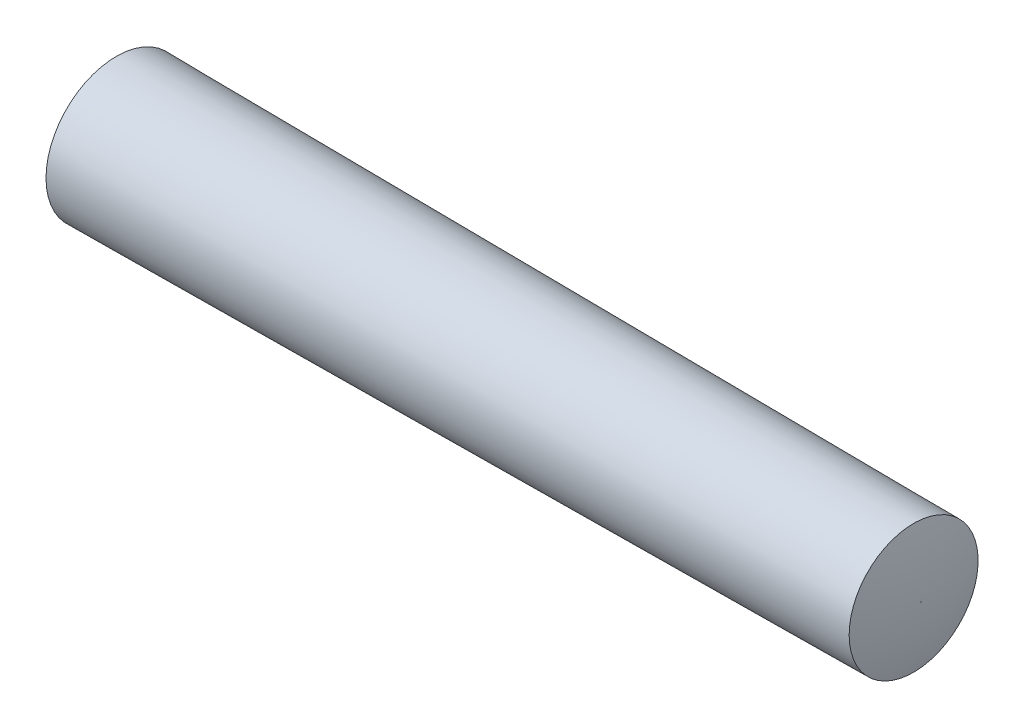
ISO-10303-21;
HEADER;
FILE_DESCRIPTION(('STEP AP214'),'2;1');
FILE_NAME('part.step','',(''),(''),'','','');
FILE_SCHEMA(('AUTOMOTIVE_DESIGN { 1 0 10303 214 1 1 1 1 }'));
ENDSEC;
DATA;
#1=APPLICATION_CONTEXT('core data for automotive mechanical design processes');
#2=APPLICATION_PROTOCOL_DEFINITION('international standard','automotive_design',2000,#1);
#3=PRODUCT_CONTEXT('',#1,'mechanical');
#4=PRODUCT('Part','Part','',(#3));
#5=PRODUCT_RELATED_PRODUCT_CATEGORY('part','',(#4));
#6=PRODUCT_DEFINITION_FORMATION('','',#4);
#7=PRODUCT_DEFINITION_CONTEXT('part definition',#1,'design');
#8=PRODUCT_DEFINITION('design','',#6,#7);
#9=PRODUCT_DEFINITION_SHAPE('','',#8);
#10=(LENGTH_UNIT() NAMED_UNIT(*) SI_UNIT(.MILLI.,.METRE.));
#11=(NAMED_UNIT(*) PLANE_ANGLE_UNIT() SI_UNIT($,.RADIAN.));
#12=(NAMED_UNIT(*) SI_UNIT($,.STERADIAN.) SOLID_ANGLE_UNIT());
#13=UNCERTAINTY_MEASURE_WITH_UNIT(LENGTH_MEASURE(1.E-05),#10,'distance_accuracy_value','');
#14=(GEOMETRIC_REPRESENTATION_CONTEXT(3) GLOBAL_UNCERTAINTY_ASSIGNED_CONTEXT((#13)) GLOBAL_UNIT_ASSIGNED_CONTEXT((#10,
#11,#12)) REPRESENTATION_CONTEXT('',''));
#15=CARTESIAN_POINT('',(0.,0.,0.));
#16=DIRECTION('',(0.,0.,1.));
#17=DIRECTION('',(1.,0.,0.));
#18=AXIS2_PLACEMENT_3D('',#15,#16,#17);
#19=CARTESIAN_POINT('',(103.649304401811,0.,0.));
#20=DIRECTION('',(-1.,0.,0.));
#21=DIRECTION('',(0.,0.,1.));
#22=AXIS2_PLACEMENT_3D('',#19,#20,#21);
#23=PLANE('',#22);
#24=CARTESIAN_POINT('',(103.649304401811,0.,0.));
#25=DIRECTION('',(-1.,0.,0.));
#26=DIRECTION('',(0.,0.,1.));
#27=AXIS2_PLACEMENT_3D('',#24,#25,#26);
#28=CIRCLE('',#27,0.0896620000000008);
#29=CARTESIAN_POINT('',(103.649304401811,0.,0.0896620000000008));
#30=VERTEX_POINT('',#29);
#31=EDGE_CURVE('E10',#30,#30,#28,.T.);
#32=ORIENTED_EDGE('',*,*,#31,.F.);
#33=EDGE_LOOP('',(#32));
#34=FACE_BOUND('',#33,.T.);
#35=ADVANCED_FACE('F30',(#34),#23,.F.);
#36=CARTESIAN_POINT('',(67.7845044018107,0.,0.));
#37=DIRECTION('',(-1.,0.,0.));
#38=DIRECTION('',(0.,0.,1.));
#39=AXIS2_PLACEMENT_3D('',#36,#37,#38);
#40=DEGENERATE_TOROIDAL_SURFACE('',#39,0.0896620000000008,35.8648,.T.);
#41=CARTESIAN_POINT('',(102.715829480364,0.,0.));
#42=DIRECTION('',(-1.,0.,0.));
#43=DIRECTION('',(0.,0.,1.));
#44=AXIS2_PLACEMENT_3D('',#41,#42,#43);
#45=CIRCLE('',#44,8.21901666666666);
#46=CARTESIAN_POINT('',(102.715829480364,0.,8.21901666666666));
#47=VERTEX_POINT('',#46);
#48=EDGE_CURVE('E36',#47,#47,#45,.T.);
#49=ORIENTED_EDGE('',*,*,#48,.F.);
#50=EDGE_LOOP('',(#49));
#51=FACE_BOUND('',#50,.T.);
#52=ORIENTED_EDGE('',*,*,#31,.T.);
#53=EDGE_LOOP('',(#52));
#54=FACE_BOUND('',#53,.T.);
#55=ADVANCED_FACE('F60',(#51,#54),#40,.T.);
#56=CARTESIAN_POINT('',(102.715829480364,0.,0.));
#57=DIRECTION('',(-1.,0.,0.));
#58=DIRECTION('',(0.,0.,1.));
#59=AXIS2_PLACEMENT_3D('',#56,#57,#58);
#60=CONICAL_SURFACE('',#59,8.21901666666666,0.00735403409062237);
#61=CARTESIAN_POINT('',(1.11582948036365,0.,0.));
#62=DIRECTION('',(-1.,0.,0.));
#63=DIRECTION('',(0.,0.,1.));
#64=AXIS2_PLACEMENT_3D('',#61,#62,#63);
#65=CIRCLE('',#64,8.9662);
#66=CARTESIAN_POINT('',(1.11582948036365,0.,8.9662));
#67=VERTEX_POINT('',#66);
#68=EDGE_CURVE('E40',#67,#67,#65,.T.);
#69=ORIENTED_EDGE('',*,*,#68,.F.);
#70=EDGE_LOOP('',(#69));
#71=FACE_BOUND('',#70,.T.);
#72=ORIENTED_EDGE('',*,*,#48,.T.);
#73=EDGE_LOOP('',(#72));
#74=FACE_BOUND('',#73,.T.);
#75=ADVANCED_FACE('F55',(#71,#74),#60,.T.);
#76=CARTESIAN_POINT('',(35.8648,0.,0.));
#77=DIRECTION('',(-1.,0.,0.));
#78=DIRECTION('',(0.,0.,1.));
#79=AXIS2_PLACEMENT_3D('',#76,#77,#78);
#80=DEGENERATE_TOROIDAL_SURFACE('',#79,0.089662,35.8648,.T.);
#81=CARTESIAN_POINT('',(0.,0.,0.));
#82=DIRECTION('',(-1.,0.,0.));
#83=DIRECTION('',(0.,0.,1.));
#84=AXIS2_PLACEMENT_3D('',#81,#82,#83);
#85=CIRCLE('',#84,0.089662);
#86=CARTESIAN_POINT('',(0.,0.,0.089662));
#87=VERTEX_POINT('',#86);
#88=EDGE_CURVE('E44',#87,#87,#85,.T.);
#89=ORIENTED_EDGE('',*,*,#88,.F.);
#90=EDGE_LOOP('',(#89));
#91=FACE_BOUND('',#90,.T.);
#92=ORIENTED_EDGE('',*,*,#68,.T.);
#93=EDGE_LOOP('',(#92));
#94=FACE_BOUND('',#93,.T.);
#95=ADVANCED_FACE('F52',(#91,#94),#80,.T.);
#96=CARTESIAN_POINT('',(0.,0.,0.));
#97=DIRECTION('',(1.,0.,0.));
#98=DIRECTION('',(0.,0.,-1.));
#99=AXIS2_PLACEMENT_3D('',#96,#97,#98);
#100=PLANE('',#99);
#101=ORIENTED_EDGE('',*,*,#88,.T.);
#102=EDGE_LOOP('',(#101));
#103=FACE_BOUND('',#102,.T.);
#104=ADVANCED_FACE('F50',(#103),#100,.F.);
#105=CLOSED_SHELL('',(#35,#55,#75,#95,#104));
#106=MANIFOLD_SOLID_BREP('B2',#105);
#107=ADVANCED_BREP_SHAPE_REPRESENTATION('',(#18,#106),#14);
#108=SHAPE_DEFINITION_REPRESENTATION(#9,#107);
ENDSEC;
END-ISO-10303-21;
